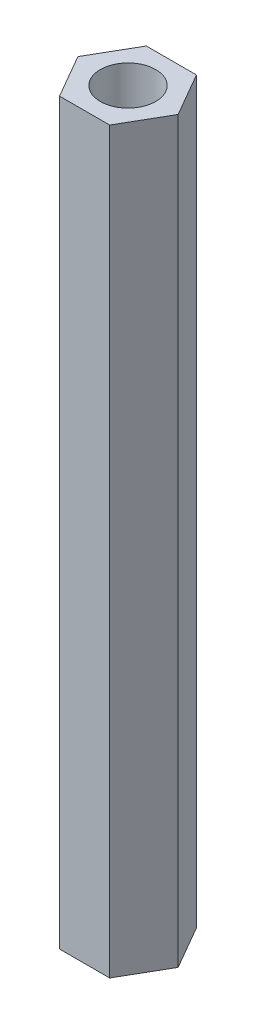
ISO-10303-21;
HEADER;
FILE_DESCRIPTION(('STEP AP214'),'2;1');
FILE_NAME('part.step','',(''),(''),'','','');
FILE_SCHEMA(('AUTOMOTIVE_DESIGN { 1 0 10303 214 1 1 1 1 }'));
ENDSEC;
DATA;
#1=APPLICATION_CONTEXT('core data for automotive mechanical design processes');
#2=APPLICATION_PROTOCOL_DEFINITION('international standard','automotive_design',2000,#1);
#3=PRODUCT_CONTEXT('',#1,'mechanical');
#4=PRODUCT('Part','Part','',(#3));
#5=PRODUCT_RELATED_PRODUCT_CATEGORY('part','',(#4));
#6=PRODUCT_DEFINITION_FORMATION('','',#4);
#7=PRODUCT_DEFINITION_CONTEXT('part definition',#1,'design');
#8=PRODUCT_DEFINITION('design','',#6,#7);
#9=PRODUCT_DEFINITION_SHAPE('','',#8);
#10=(LENGTH_UNIT() NAMED_UNIT(*) SI_UNIT(.MILLI.,.METRE.));
#11=(NAMED_UNIT(*) PLANE_ANGLE_UNIT() SI_UNIT($,.RADIAN.));
#12=(NAMED_UNIT(*) SI_UNIT($,.STERADIAN.) SOLID_ANGLE_UNIT());
#13=UNCERTAINTY_MEASURE_WITH_UNIT(LENGTH_MEASURE(1.E-05),#10,'distance_accuracy_value','');
#14=(GEOMETRIC_REPRESENTATION_CONTEXT(3) GLOBAL_UNCERTAINTY_ASSIGNED_CONTEXT((#13)) GLOBAL_UNIT_ASSIGNED_CONTEXT((#10,
#11,#12)) REPRESENTATION_CONTEXT('',''));
#15=CARTESIAN_POINT('',(0.,0.,0.));
#16=DIRECTION('',(0.,0.,1.));
#17=DIRECTION('',(1.,0.,0.));
#18=AXIS2_PLACEMENT_3D('',#15,#16,#17);
#19=CARTESIAN_POINT('',(0.,40.,0.));
#20=DIRECTION('',(0.,1.,0.));
#21=DIRECTION('',(0.,0.,1.));
#22=AXIS2_PLACEMENT_3D('',#19,#20,#21);
#23=PLANE('',#22);
#24=DIRECTION('',(1.,0.,0.));
#25=VECTOR('',#24,1.);
#26=CARTESIAN_POINT('',(-1.35677313259562,40.,2.35));
#27=LINE('',#26,#25);
#28=CARTESIAN_POINT('',(-1.35677313259562,40.,2.35));
#29=VERTEX_POINT('',#28);
#30=CARTESIAN_POINT('',(1.35677313259562,40.,2.35));
#31=VERTEX_POINT('',#30);
#32=EDGE_CURVE('E135',#29,#31,#27,.T.);
#33=ORIENTED_EDGE('',*,*,#32,.T.);
#34=DIRECTION('',(0.499999999999999,0.,-0.866025403784439));
#35=VECTOR('',#34,1.);
#36=CARTESIAN_POINT('',(1.35677313259562,40.,2.35));
#37=LINE('',#36,#35);
#38=CARTESIAN_POINT('',(2.71354626519124,40.,0.));
#39=VERTEX_POINT('',#38);
#40=EDGE_CURVE('E93',#31,#39,#37,.T.);
#41=ORIENTED_EDGE('',*,*,#40,.T.);
#42=DIRECTION('',(-0.5,0.,-0.866025403784439));
#43=VECTOR('',#42,1.);
#44=CARTESIAN_POINT('',(2.71354626519124,40.,0.));
#45=LINE('',#44,#43);
#46=CARTESIAN_POINT('',(1.35677313259562,40.,-2.35));
#47=VERTEX_POINT('',#46);
#48=EDGE_CURVE('E106',#39,#47,#45,.T.);
#49=ORIENTED_EDGE('',*,*,#48,.T.);
#50=DIRECTION('',(-1.,0.,0.));
#51=VECTOR('',#50,1.);
#52=CARTESIAN_POINT('',(1.35677313259562,40.,-2.35));
#53=LINE('',#52,#51);
#54=CARTESIAN_POINT('',(-1.35677313259562,40.,-2.35));
#55=VERTEX_POINT('',#54);
#56=EDGE_CURVE('E100',#47,#55,#53,.T.);
#57=ORIENTED_EDGE('',*,*,#56,.T.);
#58=DIRECTION('',(-0.499999999999999,0.,0.866025403784439));
#59=VECTOR('',#58,1.);
#60=CARTESIAN_POINT('',(-1.35677313259562,40.,-2.35));
#61=LINE('',#60,#59);
#62=CARTESIAN_POINT('',(-2.71354626519124,40.,0.));
#63=VERTEX_POINT('',#62);
#64=EDGE_CURVE('E104',#55,#63,#61,.T.);
#65=ORIENTED_EDGE('',*,*,#64,.T.);
#66=DIRECTION('',(0.499999999999999,0.,0.866025403784439));
#67=VECTOR('',#66,1.);
#68=CARTESIAN_POINT('',(-2.71354626519124,40.,0.));
#69=LINE('',#68,#67);
#70=EDGE_CURVE('E56',#63,#29,#69,.T.);
#71=ORIENTED_EDGE('',*,*,#70,.T.);
#72=EDGE_LOOP('',(#33,#41,#49,#57,#65,#71));
#73=FACE_BOUND('',#72,.T.);
#74=CARTESIAN_POINT('',(0.,40.,0.));
#75=DIRECTION('',(0.,1.,0.));
#76=DIRECTION('',(0.,0.,1.));
#77=AXIS2_PLACEMENT_3D('',#74,#75,#76);
#78=CIRCLE('',#77,1.5);
#79=CARTESIAN_POINT('',(0.,40.,1.5));
#80=VERTEX_POINT('',#79);
#81=EDGE_CURVE('E128',#80,#80,#78,.T.);
#82=ORIENTED_EDGE('',*,*,#81,.F.);
#83=EDGE_LOOP('',(#82));
#84=FACE_BOUND('',#83,.T.);
#85=ADVANCED_FACE('F39',(#73,#84),#23,.T.);
#86=CARTESIAN_POINT('',(0.,0.,0.));
#87=DIRECTION('',(0.,1.,0.));
#88=DIRECTION('',(0.,0.,1.));
#89=AXIS2_PLACEMENT_3D('',#86,#87,#88);
#90=PLANE('',#89);
#91=DIRECTION('',(1.,0.,0.));
#92=VECTOR('',#91,1.);
#93=CARTESIAN_POINT('',(-1.35677313259562,0.,2.35));
#94=LINE('',#93,#92);
#95=CARTESIAN_POINT('',(-1.35677313259562,0.,2.35));
#96=VERTEX_POINT('',#95);
#97=CARTESIAN_POINT('',(1.35677313259562,0.,2.35));
#98=VERTEX_POINT('',#97);
#99=EDGE_CURVE('E124',#96,#98,#94,.T.);
#100=ORIENTED_EDGE('',*,*,#99,.F.);
#101=DIRECTION('',(0.499999999999999,0.,0.866025403784439));
#102=VECTOR('',#101,1.);
#103=CARTESIAN_POINT('',(-2.71354626519124,0.,0.));
#104=LINE('',#103,#102);
#105=CARTESIAN_POINT('',(-2.71354626519124,0.,0.));
#106=VERTEX_POINT('',#105);
#107=EDGE_CURVE('E85',#106,#96,#104,.T.);
#108=ORIENTED_EDGE('',*,*,#107,.F.);
#109=DIRECTION('',(-0.499999999999999,0.,0.866025403784439));
#110=VECTOR('',#109,1.);
#111=CARTESIAN_POINT('',(-1.35677313259562,0.,-2.35));
#112=LINE('',#111,#110);
#113=CARTESIAN_POINT('',(-1.35677313259562,0.,-2.35));
#114=VERTEX_POINT('',#113);
#115=EDGE_CURVE('E79',#114,#106,#112,.T.);
#116=ORIENTED_EDGE('',*,*,#115,.F.);
#117=DIRECTION('',(-1.,0.,0.));
#118=VECTOR('',#117,1.);
#119=CARTESIAN_POINT('',(1.35677313259562,0.,-2.35));
#120=LINE('',#119,#118);
#121=CARTESIAN_POINT('',(1.35677313259562,0.,-2.35));
#122=VERTEX_POINT('',#121);
#123=EDGE_CURVE('E114',#122,#114,#120,.T.);
#124=ORIENTED_EDGE('',*,*,#123,.F.);
#125=DIRECTION('',(-0.5,0.,-0.866025403784439));
#126=VECTOR('',#125,1.);
#127=CARTESIAN_POINT('',(2.71354626519124,0.,0.));
#128=LINE('',#127,#126);
#129=CARTESIAN_POINT('',(2.71354626519124,0.,0.));
#130=VERTEX_POINT('',#129);
#131=EDGE_CURVE('E130',#130,#122,#128,.T.);
#132=ORIENTED_EDGE('',*,*,#131,.F.);
#133=DIRECTION('',(0.499999999999999,0.,-0.866025403784439));
#134=VECTOR('',#133,1.);
#135=CARTESIAN_POINT('',(1.35677313259562,0.,2.35));
#136=LINE('',#135,#134);
#137=EDGE_CURVE('E127',#98,#130,#136,.T.);
#138=ORIENTED_EDGE('',*,*,#137,.F.);
#139=EDGE_LOOP('',(#100,#108,#116,#124,#132,#138));
#140=FACE_BOUND('',#139,.T.);
#141=CARTESIAN_POINT('',(0.,0.,0.));
#142=DIRECTION('',(0.,1.,0.));
#143=DIRECTION('',(0.,0.,1.));
#144=AXIS2_PLACEMENT_3D('',#141,#142,#143);
#145=CIRCLE('',#144,1.5);
#146=CARTESIAN_POINT('',(0.,0.,1.5));
#147=VERTEX_POINT('',#146);
#148=EDGE_CURVE('E246',#147,#147,#145,.T.);
#149=ORIENTED_EDGE('',*,*,#148,.T.);
#150=EDGE_LOOP('',(#149));
#151=FACE_BOUND('',#150,.T.);
#152=ADVANCED_FACE('F144',(#140,#151),#90,.F.);
#153=CARTESIAN_POINT('',(-1.35677313259562,40.,2.35));
#154=DIRECTION('',(0.,0.,-1.));
#155=DIRECTION('',(-1.,0.,0.));
#156=AXIS2_PLACEMENT_3D('',#153,#154,#155);
#157=PLANE('',#156);
#158=ORIENTED_EDGE('',*,*,#99,.T.);
#159=DIRECTION('',(0.,-1.,0.));
#160=VECTOR('',#159,1.);
#161=CARTESIAN_POINT('',(1.35677313259562,40.,2.35));
#162=LINE('',#161,#160);
#163=EDGE_CURVE('E11',#31,#98,#162,.T.);
#164=ORIENTED_EDGE('',*,*,#163,.F.);
#165=ORIENTED_EDGE('',*,*,#32,.F.);
#166=DIRECTION('',(0.,-1.,0.));
#167=VECTOR('',#166,1.);
#168=CARTESIAN_POINT('',(-1.35677313259562,40.,2.35));
#169=LINE('',#168,#167);
#170=EDGE_CURVE('E120',#29,#96,#169,.T.);
#171=ORIENTED_EDGE('',*,*,#170,.T.);
#172=EDGE_LOOP('',(#158,#164,#165,#171));
#173=FACE_BOUND('',#172,.T.);
#174=ADVANCED_FACE('F41',(#173),#157,.F.);
#175=CARTESIAN_POINT('',(1.35677313259562,40.,2.35));
#176=DIRECTION('',(-0.866025403784439,0.,-0.499999999999999));
#177=DIRECTION('',(-0.499999999999999,0.,0.866025403784439));
#178=AXIS2_PLACEMENT_3D('',#175,#176,#177);
#179=PLANE('',#178);
#180=ORIENTED_EDGE('',*,*,#137,.T.);
#181=DIRECTION('',(0.,-1.,0.));
#182=VECTOR('',#181,1.);
#183=CARTESIAN_POINT('',(2.71354626519124,40.,0.));
#184=LINE('',#183,#182);
#185=EDGE_CURVE('E48',#39,#130,#184,.T.);
#186=ORIENTED_EDGE('',*,*,#185,.F.);
#187=ORIENTED_EDGE('',*,*,#40,.F.);
#188=ORIENTED_EDGE('',*,*,#163,.T.);
#189=EDGE_LOOP('',(#180,#186,#187,#188));
#190=FACE_BOUND('',#189,.T.);
#191=ADVANCED_FACE('F169',(#190),#179,.F.);
#192=CARTESIAN_POINT('',(2.71354626519124,40.,0.));
#193=DIRECTION('',(-0.866025403784439,0.,0.5));
#194=DIRECTION('',(0.5,0.,0.866025403784439));
#195=AXIS2_PLACEMENT_3D('',#192,#193,#194);
#196=PLANE('',#195);
#197=ORIENTED_EDGE('',*,*,#131,.T.);
#198=DIRECTION('',(0.,-1.,0.));
#199=VECTOR('',#198,1.);
#200=CARTESIAN_POINT('',(1.35677313259562,40.,-2.35));
#201=LINE('',#200,#199);
#202=EDGE_CURVE('E115',#47,#122,#201,.T.);
#203=ORIENTED_EDGE('',*,*,#202,.F.);
#204=ORIENTED_EDGE('',*,*,#48,.F.);
#205=ORIENTED_EDGE('',*,*,#185,.T.);
#206=EDGE_LOOP('',(#197,#203,#204,#205));
#207=FACE_BOUND('',#206,.T.);
#208=ADVANCED_FACE('F141',(#207),#196,.F.);
#209=CARTESIAN_POINT('',(1.35677313259562,40.,-2.35));
#210=DIRECTION('',(0.,0.,1.));
#211=DIRECTION('',(1.,0.,0.));
#212=AXIS2_PLACEMENT_3D('',#209,#210,#211);
#213=PLANE('',#212);
#214=ORIENTED_EDGE('',*,*,#123,.T.);
#215=DIRECTION('',(0.,-1.,0.));
#216=VECTOR('',#215,1.);
#217=CARTESIAN_POINT('',(-1.35677313259562,40.,-2.35));
#218=LINE('',#217,#216);
#219=EDGE_CURVE('E111',#55,#114,#218,.T.);
#220=ORIENTED_EDGE('',*,*,#219,.F.);
#221=ORIENTED_EDGE('',*,*,#56,.F.);
#222=ORIENTED_EDGE('',*,*,#202,.T.);
#223=EDGE_LOOP('',(#214,#220,#221,#222));
#224=FACE_BOUND('',#223,.T.);
#225=ADVANCED_FACE('F112',(#224),#213,.F.);
#226=CARTESIAN_POINT('',(-1.35677313259562,40.,-2.35));
#227=DIRECTION('',(0.866025403784439,0.,0.499999999999999));
#228=DIRECTION('',(0.499999999999999,0.,-0.866025403784439));
#229=AXIS2_PLACEMENT_3D('',#226,#227,#228);
#230=PLANE('',#229);
#231=ORIENTED_EDGE('',*,*,#115,.T.);
#232=DIRECTION('',(0.,-1.,0.));
#233=VECTOR('',#232,1.);
#234=CARTESIAN_POINT('',(-2.71354626519124,40.,0.));
#235=LINE('',#234,#233);
#236=EDGE_CURVE('E116',#63,#106,#235,.T.);
#237=ORIENTED_EDGE('',*,*,#236,.F.);
#238=ORIENTED_EDGE('',*,*,#64,.F.);
#239=ORIENTED_EDGE('',*,*,#219,.T.);
#240=EDGE_LOOP('',(#231,#237,#238,#239));
#241=FACE_BOUND('',#240,.T.);
#242=ADVANCED_FACE('F118',(#241),#230,.F.);
#243=CARTESIAN_POINT('',(-2.71354626519124,40.,0.));
#244=DIRECTION('',(0.866025403784439,0.,-0.499999999999999));
#245=DIRECTION('',(-0.499999999999999,0.,-0.866025403784439));
#246=AXIS2_PLACEMENT_3D('',#243,#244,#245);
#247=PLANE('',#246);
#248=ORIENTED_EDGE('',*,*,#107,.T.);
#249=ORIENTED_EDGE('',*,*,#170,.F.);
#250=ORIENTED_EDGE('',*,*,#70,.F.);
#251=ORIENTED_EDGE('',*,*,#236,.T.);
#252=EDGE_LOOP('',(#248,#249,#250,#251));
#253=FACE_BOUND('',#252,.T.);
#254=ADVANCED_FACE('F149',(#253),#247,.F.);
#255=CARTESIAN_POINT('',(0.,40.,0.));
#256=DIRECTION('',(0.,-1.,0.));
#257=DIRECTION('',(0.,0.,-1.));
#258=AXIS2_PLACEMENT_3D('',#255,#256,#257);
#259=CYLINDRICAL_SURFACE('',#258,1.5);
#260=ORIENTED_EDGE('',*,*,#81,.T.);
#261=EDGE_LOOP('',(#260));
#262=FACE_BOUND('',#261,.T.);
#263=ORIENTED_EDGE('',*,*,#148,.F.);
#264=EDGE_LOOP('',(#263));
#265=FACE_BOUND('',#264,.T.);
#266=ADVANCED_FACE('F151',(#262,#265),#259,.F.);
#267=CLOSED_SHELL('',(#85,#152,#174,#191,#208,#225,#242,#254,#266));
#268=MANIFOLD_SOLID_BREP('B2',#267);
#269=ADVANCED_BREP_SHAPE_REPRESENTATION('',(#18,#268),#14);
#270=SHAPE_DEFINITION_REPRESENTATION(#9,#269);
ENDSEC;
END-ISO-10303-21;
